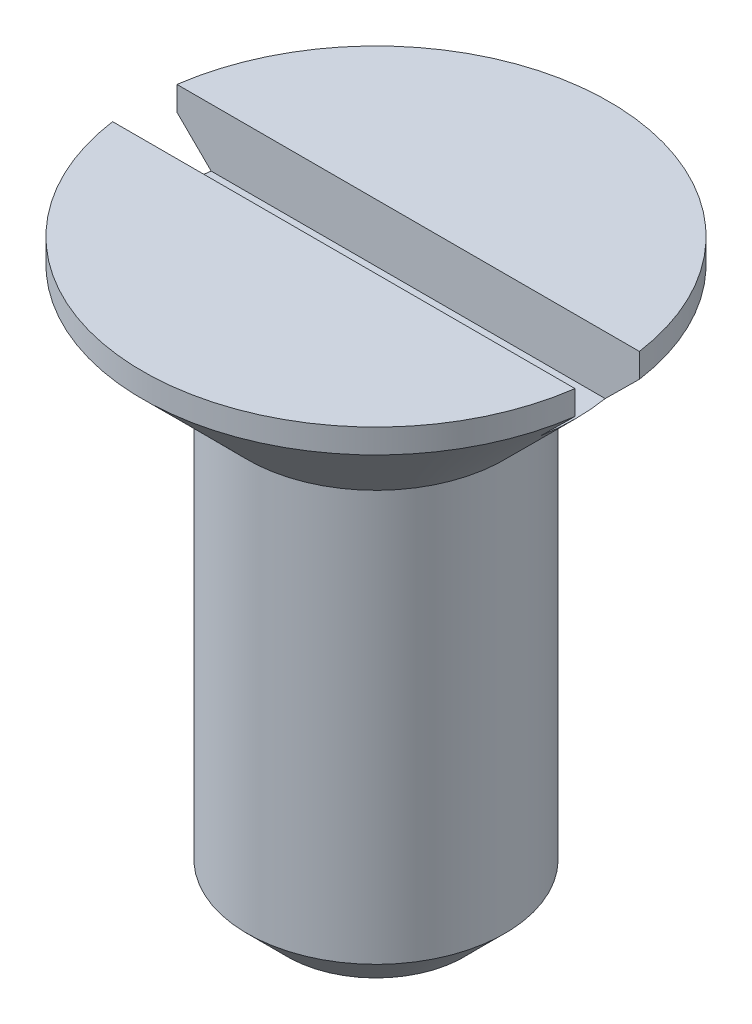
ISO-10303-21;
HEADER;
FILE_DESCRIPTION(('STEP AP214'),'2;1');
FILE_NAME('part.step','',(''),(''),'','','');
FILE_SCHEMA(('AUTOMOTIVE_DESIGN { 1 0 10303 214 1 1 1 1 }'));
ENDSEC;
DATA;
#1=APPLICATION_CONTEXT('core data for automotive mechanical design processes');
#2=APPLICATION_PROTOCOL_DEFINITION('international standard','automotive_design',2000,#1);
#3=PRODUCT_CONTEXT('',#1,'mechanical');
#4=PRODUCT('Part','Part','',(#3));
#5=PRODUCT_RELATED_PRODUCT_CATEGORY('part','',(#4));
#6=PRODUCT_DEFINITION_FORMATION('','',#4);
#7=PRODUCT_DEFINITION_CONTEXT('part definition',#1,'design');
#8=PRODUCT_DEFINITION('design','',#6,#7);
#9=PRODUCT_DEFINITION_SHAPE('','',#8);
#10=(LENGTH_UNIT() NAMED_UNIT(*) SI_UNIT(.MILLI.,.METRE.));
#11=(NAMED_UNIT(*) PLANE_ANGLE_UNIT() SI_UNIT($,.RADIAN.));
#12=(NAMED_UNIT(*) SI_UNIT($,.STERADIAN.) SOLID_ANGLE_UNIT());
#13=UNCERTAINTY_MEASURE_WITH_UNIT(LENGTH_MEASURE(1.E-05),#10,'distance_accuracy_value','');
#14=(GEOMETRIC_REPRESENTATION_CONTEXT(3) GLOBAL_UNCERTAINTY_ASSIGNED_CONTEXT((#13)) GLOBAL_UNIT_ASSIGNED_CONTEXT((#10,
#11,#12)) REPRESENTATION_CONTEXT('',''));
#15=CARTESIAN_POINT('',(0.,0.,0.));
#16=DIRECTION('',(0.,0.,1.));
#17=DIRECTION('',(1.,0.,0.));
#18=AXIS2_PLACEMENT_3D('',#15,#16,#17);
#19=CARTESIAN_POINT('',(0.,125.763182897862,0.));
#20=DIRECTION('',(0.,1.,0.));
#21=DIRECTION('',(-1.,0.,0.));
#22=AXIS2_PLACEMENT_3D('',#19,#20,#21);
#23=CYLINDRICAL_SURFACE('',#22,7.25000000000001);
#24=CARTESIAN_POINT('',(0.,91.2850422227854,0.));
#25=DIRECTION('',(0.,1.,0.));
#26=DIRECTION('',(-1.,0.,0.));
#27=AXIS2_PLACEMENT_3D('',#24,#25,#26);
#28=CIRCLE('',#27,7.25000000000001);
#29=CARTESIAN_POINT('',(7.18070330817254,91.2850422227854,-1.));
#30=VERTEX_POINT('',#29);
#31=CARTESIAN_POINT('',(-7.18070330817255,91.2850422227854,-0.999999999999999));
#32=VERTEX_POINT('',#31);
#33=EDGE_CURVE('E103',#30,#32,#28,.T.);
#34=ORIENTED_EDGE('',*,*,#33,.T.);
#35=DIRECTION('',(0.,1.,0.));
#36=VECTOR('',#35,1.);
#37=CARTESIAN_POINT('',(-7.18070330817256,125.763182897862,-0.999999999999999));
#38=LINE('',#37,#36);
#39=CARTESIAN_POINT('',(-7.18070330817255,92.0350422227854,-0.999999999999999));
#40=VERTEX_POINT('',#39);
#41=EDGE_CURVE('E136',#32,#40,#38,.T.);
#42=ORIENTED_EDGE('',*,*,#41,.T.);
#43=CARTESIAN_POINT('',(0.,92.0350422227854,0.));
#44=DIRECTION('',(0.,1.,0.));
#45=DIRECTION('',(-1.,0.,0.));
#46=AXIS2_PLACEMENT_3D('',#43,#44,#45);
#47=CIRCLE('',#46,7.25000000000001);
#48=CARTESIAN_POINT('',(7.18070330817254,92.0350422227854,-1.));
#49=VERTEX_POINT('',#48);
#50=EDGE_CURVE('E100',#49,#40,#47,.T.);
#51=ORIENTED_EDGE('',*,*,#50,.F.);
#52=DIRECTION('',(0.,1.,0.));
#53=VECTOR('',#52,1.);
#54=CARTESIAN_POINT('',(7.18070330817254,125.763182897862,-1.));
#55=LINE('',#54,#53);
#56=EDGE_CURVE('E106',#49,#30,#55,.F.);
#57=ORIENTED_EDGE('',*,*,#56,.T.);
#58=EDGE_LOOP('',(#34,#42,#51,#57));
#59=FACE_BOUND('',#58,.T.);
#60=ADVANCED_FACE('F29',(#59),#23,.T.);
#61=CARTESIAN_POINT('',(0.,92.0350422227854,0.));
#62=DIRECTION('',(0.,-1.,0.));
#63=DIRECTION('',(1.,0.,0.));
#64=AXIS2_PLACEMENT_3D('',#61,#62,#63);
#65=PLANE('',#64);
#66=ORIENTED_EDGE('',*,*,#50,.T.);
#67=DIRECTION('',(1.,0.,0.));
#68=VECTOR('',#67,1.);
#69=CARTESIAN_POINT('',(0.,92.0350422227854,-1.));
#70=LINE('',#69,#68);
#71=EDGE_CURVE('E88',#40,#49,#70,.T.);
#72=ORIENTED_EDGE('',*,*,#71,.T.);
#73=EDGE_LOOP('',(#66,#72));
#74=FACE_BOUND('',#73,.T.);
#75=ADVANCED_FACE('F162',(#74),#65,.F.);
#76=CARTESIAN_POINT('',(-7.18070330817255,91.2850422227854,1.));
#77=VERTEX_POINT('',#76);
#78=CARTESIAN_POINT('',(7.18070330817254,91.2850422227854,0.999999999999999));
#79=VERTEX_POINT('',#78);
#80=EDGE_CURVE('E89',#77,#79,#28,.T.);
#81=ORIENTED_EDGE('',*,*,#80,.T.);
#82=DIRECTION('',(0.,1.,0.));
#83=VECTOR('',#82,1.);
#84=CARTESIAN_POINT('',(7.18070330817254,125.763182897862,0.999999999999999));
#85=LINE('',#84,#83);
#86=CARTESIAN_POINT('',(7.18070330817254,92.0350422227854,0.999999999999999));
#87=VERTEX_POINT('',#86);
#88=EDGE_CURVE('E83',#79,#87,#85,.T.);
#89=ORIENTED_EDGE('',*,*,#88,.T.);
#90=CARTESIAN_POINT('',(-7.18070330817255,92.0350422227854,1.));
#91=VERTEX_POINT('',#90);
#92=EDGE_CURVE('E93',#91,#87,#47,.T.);
#93=ORIENTED_EDGE('',*,*,#92,.F.);
#94=DIRECTION('',(0.,1.,0.));
#95=VECTOR('',#94,1.);
#96=CARTESIAN_POINT('',(-7.18070330817256,125.763182897862,1.));
#97=LINE('',#96,#95);
#98=EDGE_CURVE('E44',#91,#77,#97,.F.);
#99=ORIENTED_EDGE('',*,*,#98,.T.);
#100=EDGE_LOOP('',(#81,#89,#93,#99));
#101=FACE_BOUND('',#100,.T.);
#102=ADVANCED_FACE('F31',(#101),#23,.T.);
#103=CARTESIAN_POINT('',(0.,88.0350422227853,0.));
#104=DIRECTION('',(0.,1.,0.));
#105=DIRECTION('',(-1.,0.,0.));
#106=AXIS2_PLACEMENT_3D('',#103,#104,#105);
#107=CONICAL_SURFACE('',#106,4.00000000000001,0.785398163397446);
#108=ORIENTED_EDGE('',*,*,#33,.F.);
#109=CARTESIAN_POINT('',(15.9416469253378,100.00802274278,-1.));
#110=CARTESIAN_POINT('',(15.4015805231002,99.4690235959411,-1.));
#111=CARTESIAN_POINT('',(14.8614678435495,98.9300707920781,-1.));
#112=CARTESIAN_POINT('',(13.781083584789,97.8523063575129,-1.));
#113=CARTESIAN_POINT('',(13.2408120030664,97.3134947293298,-1.));
#114=CARTESIAN_POINT('',(12.1598613582323,96.2358794867356,-1.));
#115=CARTESIAN_POINT('',(11.6191822183104,95.6970759493603,-1.));
#116=CARTESIAN_POINT('',(10.5375190062923,94.6197927392031,-1.));
#117=CARTESIAN_POINT('',(9.99653493933172,94.0813130612649,-1.));
#118=CARTESIAN_POINT('',(8.89058204658293,92.9814851128648,-1.));
#119=CARTESIAN_POINT('',(8.32559140996604,92.4201587619611,-1.));
#120=CARTESIAN_POINT('',(7.47736087450694,91.5788907789054,-1.));
#121=CARTESIAN_POINT('',(7.19448599225462,91.2985811861288,-1.));
#122=CARTESIAN_POINT('',(6.62838855646954,90.7383160952261,-1.));
#123=CARTESIAN_POINT('',(6.34516600470256,90.4583605953161,-1.));
#124=CARTESIAN_POINT('',(5.77827912606654,89.8990311975156,-1.));
#125=CARTESIAN_POINT('',(5.4946149197088,89.6196571775863,-1.));
#126=CARTESIAN_POINT('',(4.92648703338044,89.0617121061218,-1.));
#127=CARTESIAN_POINT('',(4.64202333798615,88.7831410702906,-1.));
#128=CARTESIAN_POINT('',(4.07181727352204,88.2273582551972,-1.));
#129=CARTESIAN_POINT('',(3.78607502326236,87.9501463544559,-1.));
#130=CARTESIAN_POINT('',(3.35560490369496,87.536267234326,-1.));
#131=CARTESIAN_POINT('',(3.21180764721596,87.3986327653895,-1.));
#132=CARTESIAN_POINT('',(2.9233010220332,87.124323783647,-1.));
#133=CARTESIAN_POINT('',(2.77859166464018,86.9876492589814,-1.));
#134=CARTESIAN_POINT('',(2.59424951090725,86.81531991918,-1.));
#135=CARTESIAN_POINT('',(2.55526281855759,86.7789738784827,-1.));
#136=CARTESIAN_POINT('',(2.47717409195324,86.7064056890651,-1.));
#137=CARTESIAN_POINT('',(2.43807205733208,86.6701835407392,-1.));
#138=CARTESIAN_POINT('',(2.32057003401323,86.5617265946171,-1.));
#139=CARTESIAN_POINT('',(2.24197525309417,86.4897023512171,-1.));
#140=CARTESIAN_POINT('',(2.08443396635074,86.3467031829122,-1.));
#141=CARTESIAN_POINT('',(2.00549030233869,86.2757251310184,-1.));
#142=CARTESIAN_POINT('',(1.8466972614962,86.1347912084105,-1.));
#143=CARTESIAN_POINT('',(1.76684791742629,86.0648353009312,-1.));
#144=CARTESIAN_POINT('',(1.63245709564229,85.9492428947105,-1.));
#145=CARTESIAN_POINT('',(1.57826360242517,85.9032023698815,-1.));
#146=CARTESIAN_POINT('',(1.46915630976718,85.8119840113199,-1.));
#147=CARTESIAN_POINT('',(1.41424253415612,85.7668061491679,-1.));
#148=CARTESIAN_POINT('',(1.30304895788575,85.6772482072281,-1.));
#149=CARTESIAN_POINT('',(1.2467618013311,85.6328772236505,-1.));
#150=CARTESIAN_POINT('',(1.1329546558951,85.5457519643439,-1.));
#151=CARTESIAN_POINT('',(1.07543484019747,85.5029974638086,-1.));
#152=CARTESIAN_POINT('',(0.957738868424286,85.4190678092854,-1.));
#153=CARTESIAN_POINT('',(0.897534029257709,85.3779325167795,-1.));
#154=CARTESIAN_POINT('',(0.774726478053001,85.2991531164632,-1.));
#155=CARTESIAN_POINT('',(0.71212066024577,85.2615137618674,-1.));
#156=CARTESIAN_POINT('',(0.58463607027127,85.1921767557718,-1.));
#157=CARTESIAN_POINT('',(0.519794700414171,85.1604117508603,-1.));
#158=CARTESIAN_POINT('',(0.386598240519478,85.1054750232301,-1.));
#159=CARTESIAN_POINT('',(0.31825598898491,85.0822741493592,-1.));
#160=CARTESIAN_POINT('',(0.215643489626286,85.0575340869,-1.));
#161=CARTESIAN_POINT('',(0.182565375357099,85.051035410187,-1.));
#162=CARTESIAN_POINT('',(0.115932751342344,85.0412016337841,-1.));
#163=CARTESIAN_POINT('',(0.0823782755540659,85.0378663097334,-1.));
#164=CARTESIAN_POINT('',(0.015175363346675,85.0345958978411,-1.));
#165=CARTESIAN_POINT('',(-0.0184726926005243,85.034653187539,-1.));
#166=CARTESIAN_POINT('',(-0.0855867797763775,85.038136521675,-1.));
#167=CARTESIAN_POINT('',(-0.119052792972206,85.0415628939508,-1.));
#168=CARTESIAN_POINT('',(-0.218095896104466,85.056489098756,-1.));
#169=CARTESIAN_POINT('',(-0.283004849928424,85.0726100815503,-1.));
#170=CARTESIAN_POINT('',(-0.37807925042437,85.103698044579,-1.));
#171=CARTESIAN_POINT('',(-0.409473519770148,85.1152537378602,-1.));
#172=CARTESIAN_POINT('',(-0.471497908354054,85.1402621641418,-1.));
#173=CARTESIAN_POINT('',(-0.502128186504534,85.1537144986966,-1.));
#174=CARTESIAN_POINT('',(-0.595868868216588,85.1977552411155,-1.));
#175=CARTESIAN_POINT('',(-0.657745284244573,85.2309518589156,-1.));
#176=CARTESIAN_POINT('',(-0.77898685779761,85.3016920814145,-1.));
#177=CARTESIAN_POINT('',(-0.838348690076684,85.3392412109629,-1.));
#178=CARTESIAN_POINT('',(-0.955352638481949,85.4173585345917,-1.));
#179=CARTESIAN_POINT('',(-1.01298756694911,85.457937400454,-1.));
#180=CARTESIAN_POINT('',(-1.12680327457029,85.5410896603548,-1.));
#181=CARTESIAN_POINT('',(-1.18298377101001,85.5836634377139,-1.));
#182=CARTESIAN_POINT('',(-1.29480775022121,85.6706714273311,-1.));
#183=CARTESIAN_POINT('',(-1.35043981903244,85.7151202402945,-1.));
#184=CARTESIAN_POINT('',(-1.46084353393178,85.8050821874099,-1.));
#185=CARTESIAN_POINT('',(-1.51561508383684,85.8505954391427,-1.));
#186=CARTESIAN_POINT('',(-1.62434202794496,85.9423012036205,-1.));
#187=CARTESIAN_POINT('',(-1.67829917039618,85.9884916486462,-1.));
#188=CARTESIAN_POINT('',(-1.78567779683328,86.0814848490692,-1.));
#189=CARTESIAN_POINT('',(-1.83909930526427,86.1282875762966,-1.));
#190=CARTESIAN_POINT('',(-1.99645231657426,86.2674036758124,-1.));
#191=CARTESIAN_POINT('',(-2.09978329997238,86.3603958154206,-1.));
#192=CARTESIAN_POINT('',(-2.30535187681599,86.5475823790388,-1.));
#193=CARTESIAN_POINT('',(-2.40758943219848,86.6417768446538,-1.));
#194=CARTESIAN_POINT('',(-2.61129748717713,86.8310130259292,-1.));
#195=CARTESIAN_POINT('',(-2.71276790121888,86.9260548335858,-1.));
#196=CARTESIAN_POINT('',(-2.91513796268899,87.116744607112,-1.));
#197=CARTESIAN_POINT('',(-3.01603760633095,87.212392576994,-1.));
#198=CARTESIAN_POINT('',(-3.31834120869618,87.5002339327837,-1.));
#199=CARTESIAN_POINT('',(-3.51910677321414,87.6930973958725,-1.));
#200=CARTESIAN_POINT('',(-3.91960189654487,88.0798687614929,-1.));
#201=CARTESIAN_POINT('',(-4.1193315202284,88.273776597037,-1.));
#202=CARTESIAN_POINT('',(-4.51605216659714,88.660271474396,-1.));
#203=CARTESIAN_POINT('',(-4.71305012868006,88.8528513960473,-0.999999999999999));
#204=CARTESIAN_POINT('',(-5.106592852733,89.2384798922419,-0.999999999999999));
#205=CARTESIAN_POINT('',(-5.30313760716661,89.4315284744706,-0.999999999999999));
#206=CARTESIAN_POINT('',(-5.89211103991189,90.0109918397082,-0.999999999999999));
#207=CARTESIAN_POINT('',(-6.28405640746925,90.3978977323394,-0.999999999999999));
#208=CARTESIAN_POINT('',(-7.05993708186994,91.1652278211238,-0.999999999999999));
#209=CARTESIAN_POINT('',(-7.44388567496168,91.5456385983136,-0.999999999999999));
#210=CARTESIAN_POINT('',(-8.21134036215935,92.3069077044371,-0.999999999999999));
#211=CARTESIAN_POINT('',(-8.59484645540009,92.6877660342429,-0.999999999999999));
#212=CARTESIAN_POINT('',(-9.74507016637153,93.8309130512556,-0.999999999999999));
#213=CARTESIAN_POINT('',(-10.5113551346728,94.5936369496353,-0.999999999999999));
#214=CARTESIAN_POINT('',(-12.0552502609324,96.1315061111777,-0.999999999999999));
#215=CARTESIAN_POINT('',(-12.8328514930761,96.9066603302826,-0.999999999999999));
#216=CARTESIAN_POINT('',(-14.3875418481164,98.4571928819163,-0.999999999999998));
#217=CARTESIAN_POINT('',(-15.1646310393926,99.2325711458758,-0.999999999999998));
#218=CARTESIAN_POINT('',(-15.9416469253378,100.00802274278,-0.999999999999998));
#219=B_SPLINE_CURVE_WITH_KNOTS('',3,(#109,#110,#111,#112,#113,#114,#115,#116,#117,#118,#119,
#120,#121,#122,#123,#124,#125,#126,#127,#128,#129,#130,#131,#132,#133,#134,#135,#136,#137,#138,
#139,#140,#141,#142,#143,#144,#145,#146,#147,#148,#149,#150,#151,#152,#153,#154,#155,#156,#157,
#158,#159,#160,#161,#162,#163,#164,#165,#166,#167,#168,#169,#170,#171,#172,#173,#174,#175,#176,
#177,#178,#179,#180,#181,#182,#183,#184,#185,#186,#187,#188,#189,#190,#191,#192,#193,#194,#195,
#196,#197,#198,#199,#200,#201,#202,#203,#204,#205,#206,#207,#208,#209,#210,#211,#212,#213,#214,
#215,#216,#217,#218),.UNSPECIFIED.,.F.,.F.,(4,2,2,2,2,2,2,2,2,2,2,2,2,2,2,2,2,2,2,2,2,2,2,2,2,2,
2,2,2,2,2,2,2,2,2,2,2,2,2,2,2,2,2,2,2,2,2,2,2,2,2,2,2,2,4),(0.,2.28904484412634,
4.57812807581509,6.86805999666531,9.15795443835998,11.5472454233105,12.7419522765661,
13.936653086934,15.1310709559228,16.3255120278994,17.5198443202803,18.1169919758642,
18.7141322408723,18.874035009795,19.0339382873386,19.3537494751978,19.6722243714121,
19.9906877841671,20.2040119401317,20.4173290561999,20.6323277317569,20.8472963963602,
21.0659659204581,21.2849285324336,21.5011994355439,21.716727240732,21.817728578183,
21.9187227515798,22.019490021801,22.1202670984221,22.3197943684393,22.4201190445051,
22.5204226757253,22.7307707496982,22.9413888142631,23.1527873405979,23.3642266549105,
23.577834111885,23.7914652770071,24.0045424077468,24.2176097694593,24.6346342622793,
25.0516732250663,25.4687580310788,25.8858456007274,26.7210191952182,27.5561398438487,
28.3826112639986,29.2090963298532,30.8613218105915,32.482789904467,34.104261163335,
37.3477868312394,40.6416825578108,43.9349651882643),.UNSPECIFIED.);
#220=CARTESIAN_POINT('',(6.11882341631134,90.2350422227854,-1.));
#221=VERTEX_POINT('',#220);
#222=EDGE_CURVE('E52',#30,#221,#219,.T.);
#223=ORIENTED_EDGE('',*,*,#222,.T.);
#224=CARTESIAN_POINT('',(0.,90.2350422227854,0.));
#225=DIRECTION('',(0.,1.,0.));
#226=DIRECTION('',(0.,0.,1.));
#227=AXIS2_PLACEMENT_3D('',#224,#225,#226);
#228=CIRCLE('',#227,6.20000000000001);
#229=CARTESIAN_POINT('',(6.11882341631134,90.2350422227854,0.999999999999999));
#230=VERTEX_POINT('',#229);
#231=EDGE_CURVE('E115',#230,#221,#228,.T.);
#232=ORIENTED_EDGE('',*,*,#231,.F.);
#233=CARTESIAN_POINT('',(-15.9416469253378,100.00802274278,1.));
#234=CARTESIAN_POINT('',(-15.4015805231002,99.4690235959411,1.));
#235=CARTESIAN_POINT('',(-14.8614678435495,98.9300707920781,1.));
#236=CARTESIAN_POINT('',(-13.781083584789,97.8523063575129,1.));
#237=CARTESIAN_POINT('',(-13.2408120030664,97.3134947293298,1.));
#238=CARTESIAN_POINT('',(-12.1598613582323,96.2358794867356,1.));
#239=CARTESIAN_POINT('',(-11.6191822183104,95.6970759493603,1.));
#240=CARTESIAN_POINT('',(-10.5375190062923,94.6197927392031,1.));
#241=CARTESIAN_POINT('',(-9.99653493933175,94.0813130612649,1.));
#242=CARTESIAN_POINT('',(-8.89058204658296,92.9814851128648,1.));
#243=CARTESIAN_POINT('',(-8.32559140996607,92.4201587619611,1.));
#244=CARTESIAN_POINT('',(-7.47736087450698,91.5788907789054,1.));
#245=CARTESIAN_POINT('',(-7.19448599225465,91.2985811861288,1.));
#246=CARTESIAN_POINT('',(-6.62838855646956,90.7383160952261,1.));
#247=CARTESIAN_POINT('',(-6.34516600470258,90.4583605953161,1.));
#248=CARTESIAN_POINT('',(-5.77827912606656,89.8990311975156,1.));
#249=CARTESIAN_POINT('',(-5.49461491970882,89.6196571775863,1.));
#250=CARTESIAN_POINT('',(-4.92648703338046,89.0617121061218,1.));
#251=CARTESIAN_POINT('',(-4.64202333798616,88.7831410702906,1.));
#252=CARTESIAN_POINT('',(-4.07181727352206,88.2273582551972,1.));
#253=CARTESIAN_POINT('',(-3.78607502326238,87.9501463544559,1.));
#254=CARTESIAN_POINT('',(-3.35560490369498,87.536267234326,1.));
#255=CARTESIAN_POINT('',(-3.21180764721598,87.3986327653895,1.));
#256=CARTESIAN_POINT('',(-2.92330102203321,87.124323783647,1.));
#257=CARTESIAN_POINT('',(-2.7785916646402,86.9876492589814,1.));
#258=CARTESIAN_POINT('',(-2.59424951090727,86.81531991918,1.));
#259=CARTESIAN_POINT('',(-2.55526281855761,86.7789738784827,1.));
#260=CARTESIAN_POINT('',(-2.47717409195326,86.7064056890651,1.));
#261=CARTESIAN_POINT('',(-2.4380720573321,86.6701835407392,1.));
#262=CARTESIAN_POINT('',(-2.32057003401324,86.5617265946171,1.));
#263=CARTESIAN_POINT('',(-2.24197525309418,86.4897023512171,1.));
#264=CARTESIAN_POINT('',(-2.08443396635075,86.3467031829122,1.));
#265=CARTESIAN_POINT('',(-2.00549030233869,86.2757251310184,1.));
#266=CARTESIAN_POINT('',(-1.8466972614962,86.1347912084105,1.));
#267=CARTESIAN_POINT('',(-1.7668479174263,86.0648353009312,1.));
#268=CARTESIAN_POINT('',(-1.6324570956423,85.9492428947105,1.));
#269=CARTESIAN_POINT('',(-1.57826360242518,85.9032023698815,1.));
#270=CARTESIAN_POINT('',(-1.46915630976719,85.8119840113199,1.));
#271=CARTESIAN_POINT('',(-1.41424253415613,85.7668061491679,1.));
#272=CARTESIAN_POINT('',(-1.30304895788576,85.6772482072281,1.));
#273=CARTESIAN_POINT('',(-1.2467618013311,85.6328772236504,1.));
#274=CARTESIAN_POINT('',(-1.13295465589511,85.5457519643439,1.));
#275=CARTESIAN_POINT('',(-1.07543484019748,85.5029974638086,1.));
#276=CARTESIAN_POINT('',(-0.957738868424298,85.4190678092854,1.));
#277=CARTESIAN_POINT('',(-0.897534029257721,85.3779325167795,1.));
#278=CARTESIAN_POINT('',(-0.774726478053014,85.2991531164632,1.));
#279=CARTESIAN_POINT('',(-0.712120660245784,85.2615137618674,1.));
#280=CARTESIAN_POINT('',(-0.584636070271284,85.1921767557718,1.));
#281=CARTESIAN_POINT('',(-0.519794700414186,85.1604117508603,1.));
#282=CARTESIAN_POINT('',(-0.386598240519492,85.1054750232301,1.));
#283=CARTESIAN_POINT('',(-0.318255988984924,85.0822741493592,1.));
#284=CARTESIAN_POINT('',(-0.215643489626298,85.0575340869,1.));
#285=CARTESIAN_POINT('',(-0.182565375357111,85.051035410187,1.));
#286=CARTESIAN_POINT('',(-0.115932751342355,85.0412016337841,1.));
#287=CARTESIAN_POINT('',(-0.0823782755540758,85.0378663097334,1.));
#288=CARTESIAN_POINT('',(-0.0151753633466837,85.0345958978411,1.));
#289=CARTESIAN_POINT('',(0.0184726926005155,85.034653187539,1.));
#290=CARTESIAN_POINT('',(0.0855867797763675,85.038136521675,1.));
#291=CARTESIAN_POINT('',(0.119052792972195,85.0415628939508,1.));
#292=CARTESIAN_POINT('',(0.218095896104454,85.056489098756,1.));
#293=CARTESIAN_POINT('',(0.283004849928414,85.0726100815503,1.));
#294=CARTESIAN_POINT('',(0.378079250424359,85.103698044579,1.));
#295=CARTESIAN_POINT('',(0.409473519770136,85.1152537378602,1.));
#296=CARTESIAN_POINT('',(0.471497908354041,85.1402621641418,1.));
#297=CARTESIAN_POINT('',(0.502128186504521,85.1537144986966,1.));
#298=CARTESIAN_POINT('',(0.595868868216575,85.1977552411155,1.));
#299=CARTESIAN_POINT('',(0.65774528424456,85.2309518589156,1.));
#300=CARTESIAN_POINT('',(0.778986857797598,85.3016920814145,1.));
#301=CARTESIAN_POINT('',(0.838348690076672,85.3392412109629,1.));
#302=CARTESIAN_POINT('',(0.955352638481937,85.4173585345917,1.));
#303=CARTESIAN_POINT('',(1.0129875669491,85.457937400454,1.));
#304=CARTESIAN_POINT('',(1.12680327457028,85.5410896603548,1.));
#305=CARTESIAN_POINT('',(1.18298377101,85.5836634377139,1.));
#306=CARTESIAN_POINT('',(1.29480775022119,85.6706714273311,1.));
#307=CARTESIAN_POINT('',(1.35043981903243,85.7151202402945,1.));
#308=CARTESIAN_POINT('',(1.46084353393177,85.8050821874099,1.));
#309=CARTESIAN_POINT('',(1.51561508383683,85.8505954391427,1.));
#310=CARTESIAN_POINT('',(1.62434202794494,85.9423012036205,1.));
#311=CARTESIAN_POINT('',(1.67829917039617,85.9884916486462,1.));
#312=CARTESIAN_POINT('',(1.78567779683326,86.0814848490692,1.));
#313=CARTESIAN_POINT('',(1.83909930526426,86.1282875762966,1.));
#314=CARTESIAN_POINT('',(1.99645231657425,86.2674036758124,1.));
#315=CARTESIAN_POINT('',(2.09978329997237,86.3603958154206,1.));
#316=CARTESIAN_POINT('',(2.30535187681598,86.5475823790388,1.));
#317=CARTESIAN_POINT('',(2.40758943219848,86.6417768446538,1.));
#318=CARTESIAN_POINT('',(2.61129748717712,86.8310130259292,1.));
#319=CARTESIAN_POINT('',(2.71276790121886,86.9260548335858,1.));
#320=CARTESIAN_POINT('',(2.91513796268897,87.116744607112,1.));
#321=CARTESIAN_POINT('',(3.01603760633094,87.212392576994,1.));
#322=CARTESIAN_POINT('',(3.31834120869618,87.5002339327837,1.));
#323=CARTESIAN_POINT('',(3.51910677321413,87.6930973958725,1.));
#324=CARTESIAN_POINT('',(3.91960189654487,88.0798687614929,1.));
#325=CARTESIAN_POINT('',(4.1193315202284,88.2737765970371,1.));
#326=CARTESIAN_POINT('',(4.51605216659715,88.660271474396,1.));
#327=CARTESIAN_POINT('',(4.71305012868008,88.8528513960473,0.999999999999999));
#328=CARTESIAN_POINT('',(5.10659285273301,89.238479892242,0.999999999999999));
#329=CARTESIAN_POINT('',(5.30313760716662,89.4315284744707,0.999999999999999));
#330=CARTESIAN_POINT('',(5.89211103991189,90.0109918397082,0.999999999999999));
#331=CARTESIAN_POINT('',(6.28405640746925,90.3978977323394,0.999999999999999));
#332=CARTESIAN_POINT('',(7.05993708186993,91.1652278211239,0.999999999999999));
#333=CARTESIAN_POINT('',(7.44388567496166,91.5456385983136,0.999999999999999));
#334=CARTESIAN_POINT('',(8.21134036215932,92.3069077044371,0.999999999999999));
#335=CARTESIAN_POINT('',(8.59484645540007,92.6877660342429,0.999999999999999));
#336=CARTESIAN_POINT('',(9.74507016637152,93.8309130512556,0.999999999999999));
#337=CARTESIAN_POINT('',(10.5113551346728,94.5936369496353,0.999999999999999));
#338=CARTESIAN_POINT('',(12.0552502609324,96.1315061111777,0.999999999999999));
#339=CARTESIAN_POINT('',(12.8328514930761,96.9066603302826,0.999999999999999));
#340=CARTESIAN_POINT('',(14.3875418481164,98.4571928819163,0.999999999999998));
#341=CARTESIAN_POINT('',(15.1646310393926,99.2325711458758,0.999999999999998));
#342=CARTESIAN_POINT('',(15.9416469253378,100.00802274278,0.999999999999998));
#343=B_SPLINE_CURVE_WITH_KNOTS('',3,(#233,#234,#235,#236,#237,#238,#239,#240,#241,#242,#243,
#244,#245,#246,#247,#248,#249,#250,#251,#252,#253,#254,#255,#256,#257,#258,#259,#260,#261,#262,
#263,#264,#265,#266,#267,#268,#269,#270,#271,#272,#273,#274,#275,#276,#277,#278,#279,#280,#281,
#282,#283,#284,#285,#286,#287,#288,#289,#290,#291,#292,#293,#294,#295,#296,#297,#298,#299,#300,
#301,#302,#303,#304,#305,#306,#307,#308,#309,#310,#311,#312,#313,#314,#315,#316,#317,#318,#319,
#320,#321,#322,#323,#324,#325,#326,#327,#328,#329,#330,#331,#332,#333,#334,#335,#336,#337,#338,
#339,#340,#341,#342),.UNSPECIFIED.,.F.,.F.,(4,2,2,2,2,2,2,2,2,2,2,2,2,2,2,2,2,2,2,2,2,2,2,2,2,2,
2,2,2,2,2,2,2,2,2,2,2,2,2,2,2,2,2,2,2,2,2,2,2,2,2,2,2,2,4),(0.,2.28904484412634,
4.57812807581508,6.86805999666529,9.15795443835996,11.5472454233105,12.7419522765661,
13.936653086934,15.1310709559228,16.3255120278994,17.5198443202803,18.1169919758642,
18.7141322408723,18.874035009795,19.0339382873385,19.3537494751978,19.6722243714121,
19.9906877841671,20.2040119401317,20.4173290561999,20.6323277317569,20.8472963963602,
21.0659659204581,21.2849285324336,21.5011994355439,21.716727240732,21.817728578183,
21.9187227515798,22.019490021801,22.1202670984221,22.3197943684393,22.4201190445051,
22.5204226757253,22.7307707496982,22.9413888142631,23.1527873405979,23.3642266549105,
23.577834111885,23.7914652770072,24.0045424077468,24.2176097694593,24.6346342622793,
25.0516732250663,25.4687580310788,25.8858456007274,26.7210191952183,27.5561398438487,
28.3826112639986,29.2090963298533,30.8613218105915,32.482789904467,34.104261163335,
37.3477868312395,40.6416825578109,43.9349651882643),.UNSPECIFIED.);
#344=EDGE_CURVE('E96',#230,#79,#343,.T.);
#345=ORIENTED_EDGE('',*,*,#344,.T.);
#346=ORIENTED_EDGE('',*,*,#80,.F.);
#347=CARTESIAN_POINT('',(-6.11882341631135,90.2350422227854,1.));
#348=VERTEX_POINT('',#347);
#349=EDGE_CURVE('E95',#77,#348,#343,.T.);
#350=ORIENTED_EDGE('',*,*,#349,.T.);
#351=CARTESIAN_POINT('',(-6.11882341631136,90.2350422227854,-0.999999999999999));
#352=VERTEX_POINT('',#351);
#353=EDGE_CURVE('E114',#352,#348,#228,.T.);
#354=ORIENTED_EDGE('',*,*,#353,.F.);
#355=EDGE_CURVE('E131',#352,#32,#219,.T.);
#356=ORIENTED_EDGE('',*,*,#355,.T.);
#357=EDGE_LOOP('',(#108,#223,#232,#345,#346,#350,#354,#356));
#358=FACE_BOUND('',#357,.T.);
#359=CARTESIAN_POINT('',(0.,88.0350422227853,0.));
#360=DIRECTION('',(0.,1.,0.));
#361=DIRECTION('',(-1.,0.,0.));
#362=AXIS2_PLACEMENT_3D('',#359,#360,#361);
#363=CIRCLE('',#362,4.00000000000001);
#364=CARTESIAN_POINT('',(-4.00000000000002,88.0350422227853,0.));
#365=VERTEX_POINT('',#364);
#366=EDGE_CURVE('E99',#365,#365,#363,.T.);
#367=ORIENTED_EDGE('',*,*,#366,.T.);
#368=EDGE_LOOP('',(#367));
#369=FACE_BOUND('',#368,.T.);
#370=ADVANCED_FACE('F134',(#358,#369),#107,.T.);
#371=CARTESIAN_POINT('',(0.,125.763182897862,0.));
#372=DIRECTION('',(0.,1.,0.));
#373=DIRECTION('',(-1.,0.,0.));
#374=AXIS2_PLACEMENT_3D('',#371,#372,#373);
#375=CYLINDRICAL_SURFACE('',#374,4.00000000000001);
#376=CARTESIAN_POINT('',(0.,75.2850422227854,0.));
#377=DIRECTION('',(0.,1.,0.));
#378=DIRECTION('',(-1.,0.,0.));
#379=AXIS2_PLACEMENT_3D('',#376,#377,#378);
#380=CIRCLE('',#379,4.00000000000001);
#381=CARTESIAN_POINT('',(-4.00000000000002,75.2850422227854,0.));
#382=VERTEX_POINT('',#381);
#383=EDGE_CURVE('E37',#382,#382,#380,.T.);
#384=ORIENTED_EDGE('',*,*,#383,.T.);
#385=EDGE_LOOP('',(#384));
#386=FACE_BOUND('',#385,.T.);
#387=ORIENTED_EDGE('',*,*,#366,.F.);
#388=EDGE_LOOP('',(#387));
#389=FACE_BOUND('',#388,.T.);
#390=ADVANCED_FACE('F164',(#386,#389),#375,.T.);
#391=CARTESIAN_POINT('',(4.00000000000001,74.0350422227853,0.));
#392=DIRECTION('',(0.,1.,0.));
#393=DIRECTION('',(-1.,0.,0.));
#394=AXIS2_PLACEMENT_3D('',#391,#392,#393);
#395=PLANE('',#394);
#396=CARTESIAN_POINT('',(0.,74.0350422227853,0.));
#397=DIRECTION('',(0.,1.,0.));
#398=DIRECTION('',(-1.,0.,0.));
#399=AXIS2_PLACEMENT_3D('',#396,#397,#398);
#400=CIRCLE('',#399,2.75000000000001);
#401=CARTESIAN_POINT('',(-2.75000000000002,74.0350422227853,0.));
#402=VERTEX_POINT('',#401);
#403=EDGE_CURVE('E11',#402,#402,#400,.F.);
#404=ORIENTED_EDGE('',*,*,#403,.T.);
#405=EDGE_LOOP('',(#404));
#406=FACE_BOUND('',#405,.T.);
#407=ADVANCED_FACE('F161',(#406),#395,.F.);
#408=ORIENTED_EDGE('',*,*,#92,.T.);
#409=DIRECTION('',(-1.,0.,0.));
#410=VECTOR('',#409,1.);
#411=CARTESIAN_POINT('',(0.,92.0350422227854,1.));
#412=LINE('',#411,#410);
#413=EDGE_CURVE('E80',#87,#91,#412,.T.);
#414=ORIENTED_EDGE('',*,*,#413,.T.);
#415=EDGE_LOOP('',(#408,#414));
#416=FACE_BOUND('',#415,.T.);
#417=ADVANCED_FACE('F98',(#416),#65,.F.);
#418=CARTESIAN_POINT('',(-7.25000000000001,90.2350422227854,1.));
#419=DIRECTION('',(0.,1.,0.));
#420=DIRECTION('',(0.,0.,1.));
#421=AXIS2_PLACEMENT_3D('',#418,#419,#420);
#422=PLANE('',#421);
#423=ORIENTED_EDGE('',*,*,#231,.T.);
#424=DIRECTION('',(-1.,0.,0.));
#425=VECTOR('',#424,1.);
#426=CARTESIAN_POINT('',(-7.25000000000001,90.2350422227854,-0.999999999999999));
#427=LINE('',#426,#425);
#428=EDGE_CURVE('E124',#221,#352,#427,.T.);
#429=ORIENTED_EDGE('',*,*,#428,.T.);
#430=ORIENTED_EDGE('',*,*,#353,.T.);
#431=DIRECTION('',(1.,0.,0.));
#432=VECTOR('',#431,1.);
#433=CARTESIAN_POINT('',(-7.25000000000001,90.2350422227854,1.));
#434=LINE('',#433,#432);
#435=EDGE_CURVE('E127',#348,#230,#434,.T.);
#436=ORIENTED_EDGE('',*,*,#435,.T.);
#437=EDGE_LOOP('',(#423,#429,#430,#436));
#438=FACE_BOUND('',#437,.T.);
#439=ADVANCED_FACE('F123',(#438),#422,.T.);
#440=CARTESIAN_POINT('',(-7.25000000000001,90.2350422227854,-0.999999999999999));
#441=DIRECTION('',(0.,0.,-1.));
#442=DIRECTION('',(-1.,0.,0.));
#443=AXIS2_PLACEMENT_3D('',#440,#441,#442);
#444=PLANE('',#443);
#445=ORIENTED_EDGE('',*,*,#71,.F.);
#446=ORIENTED_EDGE('',*,*,#41,.F.);
#447=ORIENTED_EDGE('',*,*,#355,.F.);
#448=ORIENTED_EDGE('',*,*,#428,.F.);
#449=ORIENTED_EDGE('',*,*,#222,.F.);
#450=ORIENTED_EDGE('',*,*,#56,.F.);
#451=EDGE_LOOP('',(#445,#446,#447,#448,#449,#450));
#452=FACE_BOUND('',#451,.T.);
#453=ADVANCED_FACE('F129',(#452),#444,.F.);
#454=CARTESIAN_POINT('',(-7.25000000000001,90.2350422227854,1.));
#455=DIRECTION('',(0.,0.,1.));
#456=DIRECTION('',(1.,0.,0.));
#457=AXIS2_PLACEMENT_3D('',#454,#455,#456);
#458=PLANE('',#457);
#459=ORIENTED_EDGE('',*,*,#413,.F.);
#460=ORIENTED_EDGE('',*,*,#88,.F.);
#461=ORIENTED_EDGE('',*,*,#344,.F.);
#462=ORIENTED_EDGE('',*,*,#435,.F.);
#463=ORIENTED_EDGE('',*,*,#349,.F.);
#464=ORIENTED_EDGE('',*,*,#98,.F.);
#465=EDGE_LOOP('',(#459,#460,#461,#462,#463,#464));
#466=FACE_BOUND('',#465,.T.);
#467=ADVANCED_FACE('F82',(#466),#458,.F.);
#468=CARTESIAN_POINT('',(0.,75.2850422227854,0.));
#469=DIRECTION('',(0.,1.,0.));
#470=DIRECTION('',(-1.,0.,0.));
#471=AXIS2_PLACEMENT_3D('',#468,#469,#470);
#472=CONICAL_SURFACE('',#471,4.00000000000001,0.785398163397443);
#473=ORIENTED_EDGE('',*,*,#403,.F.);
#474=EDGE_LOOP('',(#473));
#475=FACE_BOUND('',#474,.T.);
#476=ORIENTED_EDGE('',*,*,#383,.F.);
#477=EDGE_LOOP('',(#476));
#478=FACE_BOUND('',#477,.T.);
#479=ADVANCED_FACE('F156',(#475,#478),#472,.T.);
#480=CLOSED_SHELL('',(#60,#75,#102,#370,#390,#407,#417,#439,#453,#467,#479));
#481=MANIFOLD_SOLID_BREP('B2',#480);
#482=ADVANCED_BREP_SHAPE_REPRESENTATION('',(#18,#481),#14);
#483=SHAPE_DEFINITION_REPRESENTATION(#9,#482);
ENDSEC;
END-ISO-10303-21;
